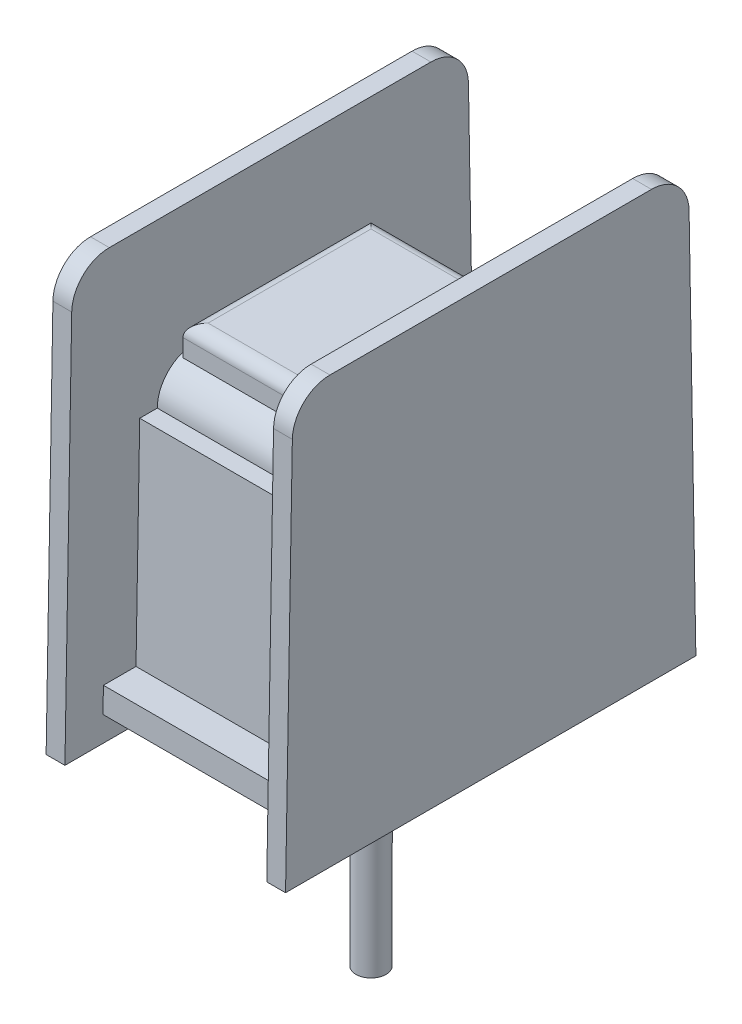
ISO-10303-21;
HEADER;
FILE_DESCRIPTION(('STEP AP214'),'2;1');
FILE_NAME('part.step','',(''),(''),'','','');
FILE_SCHEMA(('AUTOMOTIVE_DESIGN { 1 0 10303 214 1 1 1 1 }'));
ENDSEC;
DATA;
#1=APPLICATION_CONTEXT('core data for automotive mechanical design processes');
#2=APPLICATION_PROTOCOL_DEFINITION('international standard','automotive_design',2000,#1);
#3=PRODUCT_CONTEXT('',#1,'mechanical');
#4=PRODUCT('Part','Part','',(#3));
#5=PRODUCT_RELATED_PRODUCT_CATEGORY('part','',(#4));
#6=PRODUCT_DEFINITION_FORMATION('','',#4);
#7=PRODUCT_DEFINITION_CONTEXT('part definition',#1,'design');
#8=PRODUCT_DEFINITION('design','',#6,#7);
#9=PRODUCT_DEFINITION_SHAPE('','',#8);
#10=(LENGTH_UNIT() NAMED_UNIT(*) SI_UNIT(.MILLI.,.METRE.));
#11=(NAMED_UNIT(*) PLANE_ANGLE_UNIT() SI_UNIT($,.RADIAN.));
#12=(NAMED_UNIT(*) SI_UNIT($,.STERADIAN.) SOLID_ANGLE_UNIT());
#13=UNCERTAINTY_MEASURE_WITH_UNIT(LENGTH_MEASURE(1.E-05),#10,'distance_accuracy_value','');
#14=(GEOMETRIC_REPRESENTATION_CONTEXT(3) GLOBAL_UNCERTAINTY_ASSIGNED_CONTEXT((#13)) GLOBAL_UNIT_ASSIGNED_CONTEXT((#10,
#11,#12)) REPRESENTATION_CONTEXT('',''));
#15=CARTESIAN_POINT('',(0.,0.,0.));
#16=DIRECTION('',(0.,0.,1.));
#17=DIRECTION('',(1.,0.,0.));
#18=AXIS2_PLACEMENT_3D('',#15,#16,#17);
#19=CARTESIAN_POINT('',(4.025,12.,-4.5));
#20=DIRECTION('',(0.,-1.,0.));
#21=DIRECTION('',(0.,0.,-1.));
#22=AXIS2_PLACEMENT_3D('',#19,#20,#21);
#23=PLANE('',#22);
#24=DIRECTION('',(0.,0.,-1.));
#25=VECTOR('',#24,1.);
#26=CARTESIAN_POINT('',(3.75,12.,3.75));
#27=LINE('',#26,#25);
#28=CARTESIAN_POINT('',(3.75,12.,3.));
#29=VERTEX_POINT('',#28);
#30=CARTESIAN_POINT('',(3.75,12.,-3.));
#31=VERTEX_POINT('',#30);
#32=EDGE_CURVE('E259',#29,#31,#27,.T.);
#33=ORIENTED_EDGE('',*,*,#32,.F.);
#34=DIRECTION('',(1.,0.,0.));
#35=VECTOR('',#34,1.);
#36=CARTESIAN_POINT('',(4.025,12.,3.));
#37=LINE('',#36,#35);
#38=CARTESIAN_POINT('',(4.025,12.,3.));
#39=VERTEX_POINT('',#38);
#40=EDGE_CURVE('E460',#29,#39,#37,.T.);
#41=ORIENTED_EDGE('',*,*,#40,.T.);
#42=DIRECTION('',(0.,0.,-1.));
#43=VECTOR('',#42,1.);
#44=CARTESIAN_POINT('',(4.025,12.,-4.5));
#45=LINE('',#44,#43);
#46=CARTESIAN_POINT('',(4.025,12.,-3.));
#47=VERTEX_POINT('',#46);
#48=EDGE_CURVE('E293',#39,#47,#45,.T.);
#49=ORIENTED_EDGE('',*,*,#48,.T.);
#50=DIRECTION('',(-1.,0.,0.));
#51=VECTOR('',#50,1.);
#52=CARTESIAN_POINT('',(4.025,12.,-3.));
#53=LINE('',#52,#51);
#54=EDGE_CURVE('E466',#47,#31,#53,.T.);
#55=ORIENTED_EDGE('',*,*,#54,.T.);
#56=EDGE_LOOP('',(#33,#41,#49,#55));
#57=FACE_BOUND('',#56,.T.);
#58=ADVANCED_FACE('F32',(#57),#23,.F.);
#59=DIRECTION('',(0.,0.,1.));
#60=VECTOR('',#59,1.);
#61=CARTESIAN_POINT('',(-3.75,12.,3.75));
#62=LINE('',#61,#60);
#63=CARTESIAN_POINT('',(-3.75,12.,-3.));
#64=VERTEX_POINT('',#63);
#65=CARTESIAN_POINT('',(-3.75,12.,3.));
#66=VERTEX_POINT('',#65);
#67=EDGE_CURVE('E271',#64,#66,#62,.T.);
#68=ORIENTED_EDGE('',*,*,#67,.F.);
#69=CARTESIAN_POINT('',(-4.025,12.,-3.));
#70=VERTEX_POINT('',#69);
#71=EDGE_CURVE('E464',#64,#70,#53,.T.);
#72=ORIENTED_EDGE('',*,*,#71,.T.);
#73=DIRECTION('',(0.,0.,1.));
#74=VECTOR('',#73,1.);
#75=CARTESIAN_POINT('',(-4.025,12.,-4.5));
#76=LINE('',#75,#74);
#77=CARTESIAN_POINT('',(-4.025,12.,3.));
#78=VERTEX_POINT('',#77);
#79=EDGE_CURVE('E296',#70,#78,#76,.T.);
#80=ORIENTED_EDGE('',*,*,#79,.T.);
#81=EDGE_CURVE('E461',#78,#66,#37,.T.);
#82=ORIENTED_EDGE('',*,*,#81,.T.);
#83=EDGE_LOOP('',(#68,#72,#80,#82));
#84=FACE_BOUND('',#83,.T.);
#85=ADVANCED_FACE('F548',(#84),#23,.F.);
#86=CARTESIAN_POINT('',(4.025,1.,-6.68327818174629));
#87=DIRECTION('',(0.,1.,0.));
#88=DIRECTION('',(0.,0.,1.));
#89=AXIS2_PLACEMENT_3D('',#86,#87,#88);
#90=PLANE('',#89);
#91=DIRECTION('',(1.,0.,0.));
#92=VECTOR('',#91,1.);
#93=CARTESIAN_POINT('',(4.025,1.,-6.66582311681807));
#94=LINE('',#93,#92);
#95=CARTESIAN_POINT('',(-4.025,1.,-6.66582311681807));
#96=VERTEX_POINT('',#95);
#97=CARTESIAN_POINT('',(4.025,1.,-6.66582311681807));
#98=VERTEX_POINT('',#97);
#99=EDGE_CURVE('E303',#96,#98,#94,.T.);
#100=ORIENTED_EDGE('',*,*,#99,.T.);
#101=DIRECTION('',(0.,0.,1.));
#102=VECTOR('',#101,1.);
#103=CARTESIAN_POINT('',(4.025,1.,6.68327818174629));
#104=LINE('',#103,#102);
#105=CARTESIAN_POINT('',(4.025,0.999999999999997,6.66582311681807));
#106=VERTEX_POINT('',#105);
#107=EDGE_CURVE('E299',#98,#106,#104,.T.);
#108=ORIENTED_EDGE('',*,*,#107,.T.);
#109=DIRECTION('',(-1.,0.,0.));
#110=VECTOR('',#109,1.);
#111=CARTESIAN_POINT('',(4.025,1.,6.66582311681807));
#112=LINE('',#111,#110);
#113=CARTESIAN_POINT('',(-4.025,1.,6.66582311681807));
#114=VERTEX_POINT('',#113);
#115=EDGE_CURVE('E417',#106,#114,#112,.T.);
#116=ORIENTED_EDGE('',*,*,#115,.T.);
#117=DIRECTION('',(0.,0.,-1.));
#118=VECTOR('',#117,1.);
#119=CARTESIAN_POINT('',(-4.025,1.,6.68327818174629));
#120=LINE('',#119,#118);
#121=EDGE_CURVE('E301',#114,#96,#120,.T.);
#122=ORIENTED_EDGE('',*,*,#121,.T.);
#123=EDGE_LOOP('',(#100,#108,#116,#122));
#124=FACE_BOUND('',#123,.T.);
#125=CARTESIAN_POINT('',(0.,1.,0.));
#126=DIRECTION('',(0.,1.,0.));
#127=DIRECTION('',(0.,0.,1.));
#128=AXIS2_PLACEMENT_3D('',#125,#126,#127);
#129=CIRCLE('',#128,0.6);
#130=CARTESIAN_POINT('',(0.,1.,0.6));
#131=VERTEX_POINT('',#130);
#132=EDGE_CURVE('E457',#131,#131,#129,.F.);
#133=ORIENTED_EDGE('',*,*,#132,.F.);
#134=EDGE_LOOP('',(#133));
#135=FACE_BOUND('',#134,.T.);
#136=ADVANCED_FACE('F553',(#124,#135),#90,.F.);
#137=CARTESIAN_POINT('',(4.025,10.5,-8.));
#138=DIRECTION('',(0.,1.,0.));
#139=DIRECTION('',(0.,0.,1.));
#140=AXIS2_PLACEMENT_3D('',#137,#138,#139);
#141=PLANE('',#140);
#142=DIRECTION('',(0.,0.,1.));
#143=VECTOR('',#142,1.);
#144=CARTESIAN_POINT('',(-4.025,10.5,8.));
#145=LINE('',#144,#143);
#146=CARTESIAN_POINT('',(-4.025,10.5,-5.2));
#147=VERTEX_POINT('',#146);
#148=CARTESIAN_POINT('',(-4.025,10.5,-4.5));
#149=VERTEX_POINT('',#148);
#150=EDGE_CURVE('E340',#147,#149,#145,.T.);
#151=ORIENTED_EDGE('',*,*,#150,.T.);
#152=DIRECTION('',(-1.,0.,0.));
#153=VECTOR('',#152,1.);
#154=CARTESIAN_POINT('',(4.025,10.5,-4.5));
#155=LINE('',#154,#153);
#156=CARTESIAN_POINT('',(4.025,10.5,-4.5));
#157=VERTEX_POINT('',#156);
#158=EDGE_CURVE('E287',#157,#149,#155,.T.);
#159=ORIENTED_EDGE('',*,*,#158,.F.);
#160=DIRECTION('',(0.,0.,-1.));
#161=VECTOR('',#160,1.);
#162=CARTESIAN_POINT('',(4.025,10.5,8.));
#163=LINE('',#162,#161);
#164=CARTESIAN_POINT('',(4.025,10.5,-5.2));
#165=VERTEX_POINT('',#164);
#166=EDGE_CURVE('E335',#157,#165,#163,.T.);
#167=ORIENTED_EDGE('',*,*,#166,.T.);
#168=DIRECTION('',(1.,0.,0.));
#169=VECTOR('',#168,1.);
#170=CARTESIAN_POINT('',(4.025,10.5,-5.2));
#171=LINE('',#170,#169);
#172=EDGE_CURVE('E329',#147,#165,#171,.T.);
#173=ORIENTED_EDGE('',*,*,#172,.F.);
#174=EDGE_LOOP('',(#151,#159,#167,#173));
#175=FACE_BOUND('',#174,.T.);
#176=ADVANCED_FACE('F578',(#175),#141,.T.);
#177=CARTESIAN_POINT('',(4.025,10.5,5.2));
#178=VERTEX_POINT('',#177);
#179=CARTESIAN_POINT('',(4.025,10.5,4.5));
#180=VERTEX_POINT('',#179);
#181=EDGE_CURVE('E336',#178,#180,#163,.T.);
#182=ORIENTED_EDGE('',*,*,#181,.T.);
#183=DIRECTION('',(1.,0.,0.));
#184=VECTOR('',#183,1.);
#185=CARTESIAN_POINT('',(4.025,10.5,4.5));
#186=LINE('',#185,#184);
#187=CARTESIAN_POINT('',(-4.025,10.5,4.5));
#188=VERTEX_POINT('',#187);
#189=EDGE_CURVE('E290',#188,#180,#186,.T.);
#190=ORIENTED_EDGE('',*,*,#189,.F.);
#191=CARTESIAN_POINT('',(-4.025,10.5,5.2));
#192=VERTEX_POINT('',#191);
#193=EDGE_CURVE('E339',#188,#192,#145,.T.);
#194=ORIENTED_EDGE('',*,*,#193,.T.);
#195=DIRECTION('',(1.,0.,0.));
#196=VECTOR('',#195,1.);
#197=CARTESIAN_POINT('',(4.025,10.5,5.2));
#198=LINE('',#197,#196);
#199=EDGE_CURVE('E400',#192,#178,#198,.T.);
#200=ORIENTED_EDGE('',*,*,#199,.T.);
#201=EDGE_LOOP('',(#182,#190,#194,#200));
#202=FACE_BOUND('',#201,.T.);
#203=ADVANCED_FACE('F592',(#202),#141,.T.);
#204=CARTESIAN_POINT('',(4.025,10.5,8.));
#205=DIRECTION('',(1.,0.,0.));
#206=DIRECTION('',(0.,0.,-1.));
#207=AXIS2_PLACEMENT_3D('',#204,#205,#206);
#208=PLANE('',#207);
#209=DIRECTION('',(0.,-0.999847695156391,0.0174524064372836));
#210=VECTOR('',#209,1.);
#211=CARTESIAN_POINT('',(4.025,10.5,8.));
#212=LINE('',#211,#210);
#213=CARTESIAN_POINT('',(4.025,0.,8.18327818174628));
#214=VERTEX_POINT('',#213);
#215=CARTESIAN_POINT('',(4.025,15.5261786096559,7.91226772602763));
#216=VERTEX_POINT('',#215);
#217=EDGE_CURVE('E348',#214,#216,#212,.F.);
#218=ORIENTED_EDGE('',*,*,#217,.T.);
#219=CARTESIAN_POINT('',(4.025,15.5,6.41249618329305));
#220=DIRECTION('',(1.,0.,0.));
#221=DIRECTION('',(0.,0.,-1.));
#222=AXIS2_PLACEMENT_3D('',#219,#220,#221);
#223=CIRCLE('',#222,1.5);
#224=CARTESIAN_POINT('',(4.025,17.,6.41249618329305));
#225=VERTEX_POINT('',#224);
#226=EDGE_CURVE('E435',#216,#225,#223,.F.);
#227=ORIENTED_EDGE('',*,*,#226,.T.);
#228=DIRECTION('',(0.,0.,-1.));
#229=VECTOR('',#228,1.);
#230=CARTESIAN_POINT('',(4.025,17.,8.));
#231=LINE('',#230,#229);
#232=CARTESIAN_POINT('',(4.025,17.,-6.41249618329305));
#233=VERTEX_POINT('',#232);
#234=EDGE_CURVE('E325',#225,#233,#231,.T.);
#235=ORIENTED_EDGE('',*,*,#234,.T.);
#236=CARTESIAN_POINT('',(4.025,15.5,-6.41249618329305));
#237=DIRECTION('',(1.,0.,0.));
#238=DIRECTION('',(0.,0.,-1.));
#239=AXIS2_PLACEMENT_3D('',#236,#237,#238);
#240=CIRCLE('',#239,1.5);
#241=CARTESIAN_POINT('',(4.025,15.5261786096559,-7.91226772602764));
#242=VERTEX_POINT('',#241);
#243=EDGE_CURVE('E433',#233,#242,#240,.F.);
#244=ORIENTED_EDGE('',*,*,#243,.T.);
#245=DIRECTION('',(0.,-0.999847695156391,-0.0174524064372836));
#246=VECTOR('',#245,1.);
#247=CARTESIAN_POINT('',(4.025,10.5,-8.));
#248=LINE('',#247,#246);
#249=CARTESIAN_POINT('',(4.025,0.,-8.18327818174629));
#250=VERTEX_POINT('',#249);
#251=EDGE_CURVE('E343',#250,#242,#248,.F.);
#252=ORIENTED_EDGE('',*,*,#251,.F.);
#253=DIRECTION('',(0.,0.,-1.));
#254=VECTOR('',#253,1.);
#255=CARTESIAN_POINT('',(4.025,0.,-6.5));
#256=LINE('',#255,#254);
#257=EDGE_CURVE('E318',#214,#250,#256,.T.);
#258=ORIENTED_EDGE('',*,*,#257,.F.);
#259=EDGE_LOOP('',(#218,#227,#235,#244,#252,#258));
#260=FACE_BOUND('',#259,.T.);
#261=ORIENTED_EDGE('',*,*,#166,.F.);
#262=CARTESIAN_POINT('',(4.025,10.5,-3.));
#263=DIRECTION('',(1.,0.,0.));
#264=DIRECTION('',(0.,0.,-1.));
#265=AXIS2_PLACEMENT_3D('',#262,#263,#264);
#266=CIRCLE('',#265,1.5);
#267=EDGE_CURVE('E471',#157,#47,#266,.T.);
#268=ORIENTED_EDGE('',*,*,#267,.T.);
#269=ORIENTED_EDGE('',*,*,#48,.F.);
#270=CARTESIAN_POINT('',(4.025,10.5,3.));
#271=DIRECTION('',(1.,0.,0.));
#272=DIRECTION('',(0.,0.,-1.));
#273=AXIS2_PLACEMENT_3D('',#270,#271,#272);
#274=CIRCLE('',#273,1.5);
#275=EDGE_CURVE('E473',#39,#180,#274,.T.);
#276=ORIENTED_EDGE('',*,*,#275,.T.);
#277=ORIENTED_EDGE('',*,*,#181,.F.);
#278=DIRECTION('',(0.,-0.999847695156391,0.0174524064372836));
#279=VECTOR('',#278,1.);
#280=CARTESIAN_POINT('',(4.025,10.4511407046165,5.20085284217327));
#281=LINE('',#280,#279);
#282=CARTESIAN_POINT('',(4.025,2.,5.34836805188985));
#283=VERTEX_POINT('',#282);
#284=EDGE_CURVE('E397',#178,#283,#281,.T.);
#285=ORIENTED_EDGE('',*,*,#284,.T.);
#286=DIRECTION('',(0.,0.,1.));
#287=VECTOR('',#286,1.);
#288=CARTESIAN_POINT('',(4.025,2.,5.2));
#289=LINE('',#288,#287);
#290=CARTESIAN_POINT('',(4.025,2.,6.64836805188985));
#291=VERTEX_POINT('',#290);
#292=EDGE_CURVE('E306',#283,#291,#289,.T.);
#293=ORIENTED_EDGE('',*,*,#292,.T.);
#294=DIRECTION('',(0.,-0.999847695156391,0.0174524064372836));
#295=VECTOR('',#294,1.);
#296=CARTESIAN_POINT('',(4.025,10.4738253774731,6.50045687973568));
#297=LINE('',#296,#295);
#298=EDGE_CURVE('E305',#291,#106,#297,.T.);
#299=ORIENTED_EDGE('',*,*,#298,.T.);
#300=ORIENTED_EDGE('',*,*,#107,.F.);
#301=DIRECTION('',(0.,-0.999847695156391,-0.0174524064372836));
#302=VECTOR('',#301,1.);
#303=CARTESIAN_POINT('',(4.025,10.5,-6.5));
#304=LINE('',#303,#302);
#305=CARTESIAN_POINT('',(4.025,2.,-6.64836805188985));
#306=VERTEX_POINT('',#305);
#307=EDGE_CURVE('E309',#306,#98,#304,.T.);
#308=ORIENTED_EDGE('',*,*,#307,.F.);
#309=DIRECTION('',(0.,0.,-1.));
#310=VECTOR('',#309,1.);
#311=CARTESIAN_POINT('',(4.025,2.,-5.2));
#312=LINE('',#311,#310);
#313=CARTESIAN_POINT('',(4.025,2.,-5.34836805188985));
#314=VERTEX_POINT('',#313);
#315=EDGE_CURVE('E326',#314,#306,#312,.T.);
#316=ORIENTED_EDGE('',*,*,#315,.F.);
#317=DIRECTION('',(0.,-0.999847695156391,-0.0174524064372836));
#318=VECTOR('',#317,1.);
#319=CARTESIAN_POINT('',(4.025,10.5,-5.2));
#320=LINE('',#319,#318);
#321=EDGE_CURVE('E317',#165,#314,#320,.T.);
#322=ORIENTED_EDGE('',*,*,#321,.F.);
#323=EDGE_LOOP('',(#261,#268,#269,#276,#277,#285,#293,#299,#300,#308,#316,#322));
#324=FACE_BOUND('',#323,.T.);
#325=ADVANCED_FACE('F509',(#260,#324),#208,.F.);
#326=CARTESIAN_POINT('',(-4.025,10.5,8.));
#327=DIRECTION('',(-1.,0.,0.));
#328=DIRECTION('',(0.,0.,1.));
#329=AXIS2_PLACEMENT_3D('',#326,#327,#328);
#330=PLANE('',#329);
#331=DIRECTION('',(0.,0.,1.));
#332=VECTOR('',#331,1.);
#333=CARTESIAN_POINT('',(-4.025,17.,8.));
#334=LINE('',#333,#332);
#335=CARTESIAN_POINT('',(-4.025,17.,-6.41249618329305));
#336=VERTEX_POINT('',#335);
#337=CARTESIAN_POINT('',(-4.025,17.,6.41249618329305));
#338=VERTEX_POINT('',#337);
#339=EDGE_CURVE('E332',#336,#338,#334,.T.);
#340=ORIENTED_EDGE('',*,*,#339,.T.);
#341=CARTESIAN_POINT('',(-4.025,15.5,6.41249618329305));
#342=DIRECTION('',(-1.,0.,0.));
#343=DIRECTION('',(0.,0.,1.));
#344=AXIS2_PLACEMENT_3D('',#341,#342,#343);
#345=CIRCLE('',#344,1.5);
#346=CARTESIAN_POINT('',(-4.025,15.5261786096559,7.91226772602764));
#347=VERTEX_POINT('',#346);
#348=EDGE_CURVE('E445',#338,#347,#345,.F.);
#349=ORIENTED_EDGE('',*,*,#348,.T.);
#350=DIRECTION('',(0.,-0.999847695156391,0.0174524064372836));
#351=VECTOR('',#350,1.);
#352=CARTESIAN_POINT('',(-4.025,10.5,8.));
#353=LINE('',#352,#351);
#354=CARTESIAN_POINT('',(-4.025,0.,8.18327818174628));
#355=VERTEX_POINT('',#354);
#356=EDGE_CURVE('E364',#355,#347,#353,.F.);
#357=ORIENTED_EDGE('',*,*,#356,.F.);
#358=DIRECTION('',(0.,0.,-1.));
#359=VECTOR('',#358,1.);
#360=CARTESIAN_POINT('',(-4.025,0.,-6.5));
#361=LINE('',#360,#359);
#362=CARTESIAN_POINT('',(-4.025,0.,-8.18327818174629));
#363=VERTEX_POINT('',#362);
#364=EDGE_CURVE('E314',#355,#363,#361,.T.);
#365=ORIENTED_EDGE('',*,*,#364,.T.);
#366=DIRECTION('',(0.,-0.999847695156391,-0.0174524064372836));
#367=VECTOR('',#366,1.);
#368=CARTESIAN_POINT('',(-4.025,10.77919597362,-7.99512661615277));
#369=LINE('',#368,#367);
#370=CARTESIAN_POINT('',(-4.025,15.5261786096559,-7.91226772602764));
#371=VERTEX_POINT('',#370);
#372=EDGE_CURVE('E376',#363,#371,#369,.F.);
#373=ORIENTED_EDGE('',*,*,#372,.T.);
#374=CARTESIAN_POINT('',(-4.025,15.5,-6.41249618329305));
#375=DIRECTION('',(-1.,0.,0.));
#376=DIRECTION('',(0.,0.,1.));
#377=AXIS2_PLACEMENT_3D('',#374,#375,#376);
#378=CIRCLE('',#377,1.5);
#379=EDGE_CURVE('E443',#371,#336,#378,.F.);
#380=ORIENTED_EDGE('',*,*,#379,.T.);
#381=EDGE_LOOP('',(#340,#349,#357,#365,#373,#380));
#382=FACE_BOUND('',#381,.T.);
#383=ORIENTED_EDGE('',*,*,#79,.F.);
#384=CARTESIAN_POINT('',(-4.025,10.5,-3.));
#385=DIRECTION('',(-1.,0.,0.));
#386=DIRECTION('',(0.,0.,1.));
#387=AXIS2_PLACEMENT_3D('',#384,#385,#386);
#388=CIRCLE('',#387,1.5);
#389=EDGE_CURVE('E469',#70,#149,#388,.T.);
#390=ORIENTED_EDGE('',*,*,#389,.T.);
#391=ORIENTED_EDGE('',*,*,#150,.F.);
#392=DIRECTION('',(0.,0.999847695156391,0.0174524064372836));
#393=VECTOR('',#392,1.);
#394=CARTESIAN_POINT('',(-4.025,10.5,-5.2));
#395=LINE('',#394,#393);
#396=CARTESIAN_POINT('',(-4.025,2.,-5.34836805188985));
#397=VERTEX_POINT('',#396);
#398=EDGE_CURVE('E382',#397,#147,#395,.T.);
#399=ORIENTED_EDGE('',*,*,#398,.F.);
#400=DIRECTION('',(0.,0.,-1.));
#401=VECTOR('',#400,1.);
#402=CARTESIAN_POINT('',(-4.025,2.,-5.2));
#403=LINE('',#402,#401);
#404=CARTESIAN_POINT('',(-4.025,2.,-6.64836805188985));
#405=VERTEX_POINT('',#404);
#406=EDGE_CURVE('E322',#397,#405,#403,.T.);
#407=ORIENTED_EDGE('',*,*,#406,.T.);
#408=DIRECTION('',(0.,0.999847695156391,0.0174524064372836));
#409=VECTOR('',#408,1.);
#410=CARTESIAN_POINT('',(-4.025,10.5,-6.5));
#411=LINE('',#410,#409);
#412=EDGE_CURVE('E393',#96,#405,#411,.T.);
#413=ORIENTED_EDGE('',*,*,#412,.F.);
#414=ORIENTED_EDGE('',*,*,#121,.F.);
#415=DIRECTION('',(0.,0.999847695156391,-0.0174524064372836));
#416=VECTOR('',#415,1.);
#417=CARTESIAN_POINT('',(-4.025,10.4738253774731,6.50045687973568));
#418=LINE('',#417,#416);
#419=CARTESIAN_POINT('',(-4.025,2.,6.64836805188985));
#420=VERTEX_POINT('',#419);
#421=EDGE_CURVE('E401',#114,#420,#418,.T.);
#422=ORIENTED_EDGE('',*,*,#421,.T.);
#423=DIRECTION('',(0.,0.,1.));
#424=VECTOR('',#423,1.);
#425=CARTESIAN_POINT('',(-4.025,2.,5.2));
#426=LINE('',#425,#424);
#427=CARTESIAN_POINT('',(-4.025,2.,5.34836805188985));
#428=VERTEX_POINT('',#427);
#429=EDGE_CURVE('E310',#428,#420,#426,.T.);
#430=ORIENTED_EDGE('',*,*,#429,.F.);
#431=DIRECTION('',(0.,0.999847695156391,-0.0174524064372836));
#432=VECTOR('',#431,1.);
#433=CARTESIAN_POINT('',(-4.025,10.4511407046165,5.20085284217327));
#434=LINE('',#433,#432);
#435=EDGE_CURVE('E403',#428,#192,#434,.T.);
#436=ORIENTED_EDGE('',*,*,#435,.T.);
#437=ORIENTED_EDGE('',*,*,#193,.F.);
#438=CARTESIAN_POINT('',(-4.025,10.5,3.));
#439=DIRECTION('',(-1.,0.,0.));
#440=DIRECTION('',(0.,0.,1.));
#441=AXIS2_PLACEMENT_3D('',#438,#439,#440);
#442=CIRCLE('',#441,1.5);
#443=EDGE_CURVE('E475',#188,#78,#442,.T.);
#444=ORIENTED_EDGE('',*,*,#443,.T.);
#445=EDGE_LOOP('',(#383,#390,#391,#399,#407,#413,#414,#422,#430,#436,#437,#444));
#446=FACE_BOUND('',#445,.T.);
#447=ADVANCED_FACE('F594',(#382,#446),#330,.F.);
#448=CARTESIAN_POINT('',(-4.775,0.,8.));
#449=DIRECTION('',(0.,1.,0.));
#450=DIRECTION('',(0.,0.,1.));
#451=AXIS2_PLACEMENT_3D('',#448,#449,#450);
#452=PLANE('',#451);
#453=DIRECTION('',(-1.,0.,0.));
#454=VECTOR('',#453,1.);
#455=CARTESIAN_POINT('',(4.025,0.,8.18327818174628));
#456=LINE('',#455,#454);
#457=CARTESIAN_POINT('',(4.775,0.,8.18327818174628));
#458=VERTEX_POINT('',#457);
#459=EDGE_CURVE('E347',#214,#458,#456,.F.);
#460=ORIENTED_EDGE('',*,*,#459,.F.);
#461=ORIENTED_EDGE('',*,*,#257,.T.);
#462=DIRECTION('',(1.,0.,0.));
#463=VECTOR('',#462,1.);
#464=CARTESIAN_POINT('',(4.025,0.,-8.18327818174629));
#465=LINE('',#464,#463);
#466=CARTESIAN_POINT('',(4.775,0.,-8.18327818174629));
#467=VERTEX_POINT('',#466);
#468=EDGE_CURVE('E358',#467,#250,#465,.F.);
#469=ORIENTED_EDGE('',*,*,#468,.F.);
#470=DIRECTION('',(0.,0.,-1.));
#471=VECTOR('',#470,1.);
#472=CARTESIAN_POINT('',(4.775,0.,-8.));
#473=LINE('',#472,#471);
#474=EDGE_CURVE('E349',#458,#467,#473,.T.);
#475=ORIENTED_EDGE('',*,*,#474,.F.);
#476=EDGE_LOOP('',(#460,#461,#469,#475));
#477=FACE_BOUND('',#476,.T.);
#478=ADVANCED_FACE('F597',(#477),#452,.F.);
#479=CARTESIAN_POINT('',(4.025,10.5,8.));
#480=DIRECTION('',(0.,0.0174524064372835,0.999847695156391));
#481=DIRECTION('',(0.,-0.999847695156391,0.0174524064372835));
#482=AXIS2_PLACEMENT_3D('',#479,#480,#481);
#483=PLANE('',#482);
#484=DIRECTION('',(0.,0.999847695156391,-0.0174524064372835));
#485=VECTOR('',#484,1.);
#486=CARTESIAN_POINT('',(4.775,17.2772161614321,7.88170325186964));
#487=LINE('',#486,#485);
#488=CARTESIAN_POINT('',(4.775,15.5261786096559,7.91226772602764));
#489=VERTEX_POINT('',#488);
#490=EDGE_CURVE('E365',#489,#458,#487,.F.);
#491=ORIENTED_EDGE('',*,*,#490,.F.);
#492=DIRECTION('',(1.,0.,0.));
#493=VECTOR('',#492,1.);
#494=CARTESIAN_POINT('',(4.025,15.5261786096559,7.91226772602763));
#495=LINE('',#494,#493);
#496=EDGE_CURVE('E431',#489,#216,#495,.F.);
#497=ORIENTED_EDGE('',*,*,#496,.T.);
#498=ORIENTED_EDGE('',*,*,#217,.F.);
#499=ORIENTED_EDGE('',*,*,#459,.T.);
#500=EDGE_LOOP('',(#491,#497,#498,#499));
#501=FACE_BOUND('',#500,.T.);
#502=ADVANCED_FACE('F620',(#501),#483,.T.);
#503=CARTESIAN_POINT('',(4.025,10.5,8.));
#504=DIRECTION('',(0.,0.0174524064372835,0.999847695156391));
#505=DIRECTION('',(0.,-0.999847695156391,0.0174524064372835));
#506=AXIS2_PLACEMENT_3D('',#503,#504,#505);
#507=PLANE('',#506);
#508=ORIENTED_EDGE('',*,*,#356,.T.);
#509=DIRECTION('',(1.,0.,0.));
#510=VECTOR('',#509,1.);
#511=CARTESIAN_POINT('',(-4.775,15.5261786096559,7.91226772602764));
#512=LINE('',#511,#510);
#513=CARTESIAN_POINT('',(-4.775,15.5261786096559,7.91226772602764));
#514=VERTEX_POINT('',#513);
#515=EDGE_CURVE('E447',#347,#514,#512,.F.);
#516=ORIENTED_EDGE('',*,*,#515,.T.);
#517=DIRECTION('',(0.,0.999847695156391,-0.0174524064372835));
#518=VECTOR('',#517,1.);
#519=CARTESIAN_POINT('',(-4.775,10.5,8.));
#520=LINE('',#519,#518);
#521=CARTESIAN_POINT('',(-4.775,0.,8.18327818174629));
#522=VERTEX_POINT('',#521);
#523=EDGE_CURVE('E367',#514,#522,#520,.F.);
#524=ORIENTED_EDGE('',*,*,#523,.T.);
#525=DIRECTION('',(-1.,0.,0.));
#526=VECTOR('',#525,1.);
#527=CARTESIAN_POINT('',(4.025,0.,8.18327818174628));
#528=LINE('',#527,#526);
#529=EDGE_CURVE('E353',#522,#355,#528,.F.);
#530=ORIENTED_EDGE('',*,*,#529,.T.);
#531=EDGE_LOOP('',(#508,#516,#524,#530));
#532=FACE_BOUND('',#531,.T.);
#533=ADVANCED_FACE('F604',(#532),#507,.T.);
#534=ORIENTED_EDGE('',*,*,#364,.F.);
#535=ORIENTED_EDGE('',*,*,#529,.F.);
#536=DIRECTION('',(0.,0.,1.));
#537=VECTOR('',#536,1.);
#538=CARTESIAN_POINT('',(-4.775,0.,-8.));
#539=LINE('',#538,#537);
#540=CARTESIAN_POINT('',(-4.775,0.,-8.18327818174629));
#541=VERTEX_POINT('',#540);
#542=EDGE_CURVE('E344',#541,#522,#539,.T.);
#543=ORIENTED_EDGE('',*,*,#542,.F.);
#544=DIRECTION('',(1.,0.,0.));
#545=VECTOR('',#544,1.);
#546=CARTESIAN_POINT('',(4.025,0.,-8.18327818174629));
#547=LINE('',#546,#545);
#548=EDGE_CURVE('E352',#363,#541,#547,.F.);
#549=ORIENTED_EDGE('',*,*,#548,.F.);
#550=EDGE_LOOP('',(#534,#535,#543,#549));
#551=FACE_BOUND('',#550,.T.);
#552=ADVANCED_FACE('F583',(#551),#452,.F.);
#553=CARTESIAN_POINT('',(4.025,2.,5.2));
#554=DIRECTION('',(0.,1.,0.));
#555=DIRECTION('',(0.,0.,1.));
#556=AXIS2_PLACEMENT_3D('',#553,#554,#555);
#557=PLANE('',#556);
#558=ORIENTED_EDGE('',*,*,#429,.T.);
#559=DIRECTION('',(1.,0.,0.));
#560=VECTOR('',#559,1.);
#561=CARTESIAN_POINT('',(4.025,2.,6.64836805188985));
#562=LINE('',#561,#560);
#563=EDGE_CURVE('E410',#420,#291,#562,.T.);
#564=ORIENTED_EDGE('',*,*,#563,.T.);
#565=ORIENTED_EDGE('',*,*,#292,.F.);
#566=DIRECTION('',(-1.,0.,0.));
#567=VECTOR('',#566,1.);
#568=CARTESIAN_POINT('',(4.025,2.,5.34836805188985));
#569=LINE('',#568,#567);
#570=EDGE_CURVE('E313',#283,#428,#569,.T.);
#571=ORIENTED_EDGE('',*,*,#570,.T.);
#572=EDGE_LOOP('',(#558,#564,#565,#571));
#573=FACE_BOUND('',#572,.T.);
#574=ADVANCED_FACE('F580',(#573),#557,.T.);
#575=CARTESIAN_POINT('',(4.025,10.5,-8.));
#576=DIRECTION('',(0.,0.0174524064372835,-0.999847695156391));
#577=DIRECTION('',(0.,0.999847695156391,0.0174524064372835));
#578=AXIS2_PLACEMENT_3D('',#575,#576,#577);
#579=PLANE('',#578);
#580=ORIENTED_EDGE('',*,*,#251,.T.);
#581=DIRECTION('',(-1.,0.,0.));
#582=VECTOR('',#581,1.);
#583=CARTESIAN_POINT('',(4.775,15.5261786096559,-7.91226772602764));
#584=LINE('',#583,#582);
#585=CARTESIAN_POINT('',(4.775,15.5261786096559,-7.91226772602764));
#586=VERTEX_POINT('',#585);
#587=EDGE_CURVE('E455',#242,#586,#584,.F.);
#588=ORIENTED_EDGE('',*,*,#587,.T.);
#589=DIRECTION('',(0.,0.999847695156391,0.0174524064372835));
#590=VECTOR('',#589,1.);
#591=CARTESIAN_POINT('',(4.775,10.5,-8.));
#592=LINE('',#591,#590);
#593=EDGE_CURVE('E368',#586,#467,#592,.F.);
#594=ORIENTED_EDGE('',*,*,#593,.T.);
#595=ORIENTED_EDGE('',*,*,#468,.T.);
#596=EDGE_LOOP('',(#580,#588,#594,#595));
#597=FACE_BOUND('',#596,.T.);
#598=ADVANCED_FACE('F34',(#597),#579,.T.);
#599=CARTESIAN_POINT('',(4.025,2.,-5.2));
#600=DIRECTION('',(0.,-1.,0.));
#601=DIRECTION('',(0.,0.,-1.));
#602=AXIS2_PLACEMENT_3D('',#599,#600,#601);
#603=PLANE('',#602);
#604=DIRECTION('',(1.,0.,0.));
#605=VECTOR('',#604,1.);
#606=CARTESIAN_POINT('',(4.025,2.,-6.64836805188985));
#607=LINE('',#606,#605);
#608=EDGE_CURVE('E321',#405,#306,#607,.T.);
#609=ORIENTED_EDGE('',*,*,#608,.F.);
#610=ORIENTED_EDGE('',*,*,#406,.F.);
#611=DIRECTION('',(-1.,0.,0.));
#612=VECTOR('',#611,1.);
#613=CARTESIAN_POINT('',(4.025,2.,-5.34836805188985));
#614=LINE('',#613,#612);
#615=EDGE_CURVE('E379',#314,#397,#614,.T.);
#616=ORIENTED_EDGE('',*,*,#615,.F.);
#617=ORIENTED_EDGE('',*,*,#315,.T.);
#618=EDGE_LOOP('',(#609,#610,#616,#617));
#619=FACE_BOUND('',#618,.T.);
#620=ADVANCED_FACE('F585',(#619),#603,.F.);
#621=CARTESIAN_POINT('',(-4.775,17.,8.));
#622=DIRECTION('',(0.,1.,0.));
#623=DIRECTION('',(0.,0.,1.));
#624=AXIS2_PLACEMENT_3D('',#621,#622,#623);
#625=PLANE('',#624);
#626=ORIENTED_EDGE('',*,*,#234,.F.);
#627=DIRECTION('',(-1.,0.,0.));
#628=VECTOR('',#627,1.);
#629=CARTESIAN_POINT('',(4.775,17.,6.41249618329305));
#630=LINE('',#629,#628);
#631=CARTESIAN_POINT('',(4.775,17.,6.41249618329305));
#632=VERTEX_POINT('',#631);
#633=EDGE_CURVE('E424',#225,#632,#630,.F.);
#634=ORIENTED_EDGE('',*,*,#633,.T.);
#635=DIRECTION('',(0.,0.,-1.));
#636=VECTOR('',#635,1.);
#637=CARTESIAN_POINT('',(4.775,17.,-8.));
#638=LINE('',#637,#636);
#639=CARTESIAN_POINT('',(4.775,17.,-6.41249618329305));
#640=VERTEX_POINT('',#639);
#641=EDGE_CURVE('E357',#632,#640,#638,.T.);
#642=ORIENTED_EDGE('',*,*,#641,.T.);
#643=DIRECTION('',(1.,0.,0.));
#644=VECTOR('',#643,1.);
#645=CARTESIAN_POINT('',(4.025,17.,-6.41249618329305));
#646=LINE('',#645,#644);
#647=EDGE_CURVE('E421',#640,#233,#646,.F.);
#648=ORIENTED_EDGE('',*,*,#647,.T.);
#649=EDGE_LOOP('',(#626,#634,#642,#648));
#650=FACE_BOUND('',#649,.T.);
#651=ADVANCED_FACE('F588',(#650),#625,.T.);
#652=CARTESIAN_POINT('',(-4.775,17.,-8.));
#653=DIRECTION('',(1.,0.,0.));
#654=DIRECTION('',(0.,0.,-1.));
#655=AXIS2_PLACEMENT_3D('',#652,#653,#654);
#656=PLANE('',#655);
#657=ORIENTED_EDGE('',*,*,#523,.F.);
#658=CARTESIAN_POINT('',(-4.775,15.5,6.41249618329305));
#659=DIRECTION('',(1.,0.,0.));
#660=DIRECTION('',(0.,0.,-1.));
#661=AXIS2_PLACEMENT_3D('',#658,#659,#660);
#662=CIRCLE('',#661,1.5);
#663=CARTESIAN_POINT('',(-4.775,17.,6.41249618329305));
#664=VERTEX_POINT('',#663);
#665=EDGE_CURVE('E451',#514,#664,#662,.F.);
#666=ORIENTED_EDGE('',*,*,#665,.T.);
#667=DIRECTION('',(0.,0.,1.));
#668=VECTOR('',#667,1.);
#669=CARTESIAN_POINT('',(-4.775,17.,-8.));
#670=LINE('',#669,#668);
#671=CARTESIAN_POINT('',(-4.775,17.,-6.41249618329305));
#672=VERTEX_POINT('',#671);
#673=EDGE_CURVE('E354',#672,#664,#670,.T.);
#674=ORIENTED_EDGE('',*,*,#673,.F.);
#675=CARTESIAN_POINT('',(-4.775,15.5,-6.41249618329305));
#676=DIRECTION('',(1.,0.,0.));
#677=DIRECTION('',(0.,0.,-1.));
#678=AXIS2_PLACEMENT_3D('',#675,#676,#677);
#679=CIRCLE('',#678,1.5);
#680=CARTESIAN_POINT('',(-4.775,15.5261786096559,-7.91226772602764));
#681=VERTEX_POINT('',#680);
#682=EDGE_CURVE('E449',#672,#681,#679,.F.);
#683=ORIENTED_EDGE('',*,*,#682,.T.);
#684=DIRECTION('',(0.,0.999847695156391,0.0174524064372835));
#685=VECTOR('',#684,1.);
#686=CARTESIAN_POINT('',(-4.775,16.9980201878121,-7.88657663571687));
#687=LINE('',#686,#685);
#688=EDGE_CURVE('E361',#681,#541,#687,.F.);
#689=ORIENTED_EDGE('',*,*,#688,.T.);
#690=ORIENTED_EDGE('',*,*,#542,.T.);
#691=EDGE_LOOP('',(#657,#666,#674,#683,#689,#690));
#692=FACE_BOUND('',#691,.T.);
#693=ADVANCED_FACE('F615',(#692),#656,.F.);
#694=CARTESIAN_POINT('',(4.775,17.,-8.));
#695=DIRECTION('',(-1.,0.,0.));
#696=DIRECTION('',(0.,0.,1.));
#697=AXIS2_PLACEMENT_3D('',#694,#695,#696);
#698=PLANE('',#697);
#699=ORIENTED_EDGE('',*,*,#641,.F.);
#700=CARTESIAN_POINT('',(4.775,15.5,6.41249618329305));
#701=DIRECTION('',(-1.,0.,0.));
#702=DIRECTION('',(0.,0.,1.));
#703=AXIS2_PLACEMENT_3D('',#700,#701,#702);
#704=CIRCLE('',#703,1.5);
#705=EDGE_CURVE('E429',#632,#489,#704,.F.);
#706=ORIENTED_EDGE('',*,*,#705,.T.);
#707=ORIENTED_EDGE('',*,*,#490,.T.);
#708=ORIENTED_EDGE('',*,*,#474,.T.);
#709=ORIENTED_EDGE('',*,*,#593,.F.);
#710=CARTESIAN_POINT('',(4.775,15.5,-6.41249618329305));
#711=DIRECTION('',(-1.,0.,0.));
#712=DIRECTION('',(0.,0.,1.));
#713=AXIS2_PLACEMENT_3D('',#710,#711,#712);
#714=CIRCLE('',#713,1.5);
#715=EDGE_CURVE('E427',#586,#640,#714,.F.);
#716=ORIENTED_EDGE('',*,*,#715,.T.);
#717=EDGE_LOOP('',(#699,#706,#707,#708,#709,#716));
#718=FACE_BOUND('',#717,.T.);
#719=ADVANCED_FACE('F612',(#718),#698,.F.);
#720=CARTESIAN_POINT('',(4.025,10.5,-8.));
#721=DIRECTION('',(0.,0.0174524064372835,-0.999847695156391));
#722=DIRECTION('',(0.,0.999847695156391,0.0174524064372835));
#723=AXIS2_PLACEMENT_3D('',#720,#721,#722);
#724=PLANE('',#723);
#725=ORIENTED_EDGE('',*,*,#688,.F.);
#726=DIRECTION('',(-1.,0.,0.));
#727=VECTOR('',#726,1.);
#728=CARTESIAN_POINT('',(-4.025,15.5261786096559,-7.91226772602764));
#729=LINE('',#728,#727);
#730=EDGE_CURVE('E453',#681,#371,#729,.F.);
#731=ORIENTED_EDGE('',*,*,#730,.T.);
#732=ORIENTED_EDGE('',*,*,#372,.F.);
#733=ORIENTED_EDGE('',*,*,#548,.T.);
#734=EDGE_LOOP('',(#725,#731,#732,#733));
#735=FACE_BOUND('',#734,.T.);
#736=ADVANCED_FACE('F610',(#735),#724,.T.);
#737=ORIENTED_EDGE('',*,*,#673,.T.);
#738=DIRECTION('',(-1.,0.,0.));
#739=VECTOR('',#738,1.);
#740=CARTESIAN_POINT('',(-4.025,17.,6.41249618329305));
#741=LINE('',#740,#739);
#742=EDGE_CURVE('E440',#664,#338,#741,.F.);
#743=ORIENTED_EDGE('',*,*,#742,.T.);
#744=ORIENTED_EDGE('',*,*,#339,.F.);
#745=DIRECTION('',(1.,0.,0.));
#746=VECTOR('',#745,1.);
#747=CARTESIAN_POINT('',(-4.775,17.,-6.41249618329305));
#748=LINE('',#747,#746);
#749=EDGE_CURVE('E437',#336,#672,#748,.F.);
#750=ORIENTED_EDGE('',*,*,#749,.T.);
#751=EDGE_LOOP('',(#737,#743,#744,#750));
#752=FACE_BOUND('',#751,.T.);
#753=ADVANCED_FACE('F606',(#752),#625,.T.);
#754=CARTESIAN_POINT('',(4.025,10.5,-5.2));
#755=DIRECTION('',(0.,0.0174524064372835,-0.999847695156391));
#756=DIRECTION('',(0.,0.999847695156391,0.0174524064372835));
#757=AXIS2_PLACEMENT_3D('',#754,#755,#756);
#758=PLANE('',#757);
#759=ORIENTED_EDGE('',*,*,#321,.T.);
#760=ORIENTED_EDGE('',*,*,#615,.T.);
#761=ORIENTED_EDGE('',*,*,#398,.T.);
#762=ORIENTED_EDGE('',*,*,#172,.T.);
#763=EDGE_LOOP('',(#759,#760,#761,#762));
#764=FACE_BOUND('',#763,.T.);
#765=ADVANCED_FACE('F609',(#764),#758,.T.);
#766=CARTESIAN_POINT('',(4.025,10.5,-6.5));
#767=DIRECTION('',(0.,0.0174524064372835,-0.999847695156391));
#768=DIRECTION('',(0.,0.999847695156391,0.0174524064372835));
#769=AXIS2_PLACEMENT_3D('',#766,#767,#768);
#770=PLANE('',#769);
#771=ORIENTED_EDGE('',*,*,#99,.F.);
#772=ORIENTED_EDGE('',*,*,#412,.T.);
#773=ORIENTED_EDGE('',*,*,#608,.T.);
#774=ORIENTED_EDGE('',*,*,#307,.T.);
#775=EDGE_LOOP('',(#771,#772,#773,#774));
#776=FACE_BOUND('',#775,.T.);
#777=ADVANCED_FACE('F633',(#776),#770,.T.);
#778=CARTESIAN_POINT('',(4.025,10.5,5.2));
#779=DIRECTION('',(0.,0.0174524064372835,0.999847695156391));
#780=DIRECTION('',(0.,-0.999847695156391,0.0174524064372835));
#781=AXIS2_PLACEMENT_3D('',#778,#779,#780);
#782=PLANE('',#781);
#783=ORIENTED_EDGE('',*,*,#284,.F.);
#784=ORIENTED_EDGE('',*,*,#199,.F.);
#785=ORIENTED_EDGE('',*,*,#435,.F.);
#786=ORIENTED_EDGE('',*,*,#570,.F.);
#787=EDGE_LOOP('',(#783,#784,#785,#786));
#788=FACE_BOUND('',#787,.T.);
#789=ADVANCED_FACE('F629',(#788),#782,.T.);
#790=CARTESIAN_POINT('',(4.025,10.5,6.5));
#791=DIRECTION('',(0.,0.0174524064372835,0.999847695156391));
#792=DIRECTION('',(0.,-0.999847695156391,0.0174524064372835));
#793=AXIS2_PLACEMENT_3D('',#790,#791,#792);
#794=PLANE('',#793);
#795=ORIENTED_EDGE('',*,*,#115,.F.);
#796=ORIENTED_EDGE('',*,*,#298,.F.);
#797=ORIENTED_EDGE('',*,*,#563,.F.);
#798=ORIENTED_EDGE('',*,*,#421,.F.);
#799=EDGE_LOOP('',(#795,#796,#797,#798));
#800=FACE_BOUND('',#799,.T.);
#801=ADVANCED_FACE('F574',(#800),#794,.T.);
#802=CARTESIAN_POINT('',(-4.775,15.5,6.41249618329305));
#803=DIRECTION('',(1.,0.,0.));
#804=DIRECTION('',(0.,0.,-1.));
#805=AXIS2_PLACEMENT_3D('',#802,#803,#804);
#806=CYLINDRICAL_SURFACE('',#805,1.5);
#807=ORIENTED_EDGE('',*,*,#226,.F.);
#808=ORIENTED_EDGE('',*,*,#496,.F.);
#809=ORIENTED_EDGE('',*,*,#705,.F.);
#810=ORIENTED_EDGE('',*,*,#633,.F.);
#811=EDGE_LOOP('',(#807,#808,#809,#810));
#812=FACE_BOUND('',#811,.T.);
#813=ADVANCED_FACE('F570',(#812),#806,.T.);
#814=CARTESIAN_POINT('',(-4.775,15.5,6.41249618329305));
#815=DIRECTION('',(1.,0.,0.));
#816=DIRECTION('',(0.,0.,-1.));
#817=AXIS2_PLACEMENT_3D('',#814,#815,#816);
#818=CYLINDRICAL_SURFACE('',#817,1.5);
#819=ORIENTED_EDGE('',*,*,#665,.F.);
#820=ORIENTED_EDGE('',*,*,#515,.F.);
#821=ORIENTED_EDGE('',*,*,#348,.F.);
#822=ORIENTED_EDGE('',*,*,#742,.F.);
#823=EDGE_LOOP('',(#819,#820,#821,#822));
#824=FACE_BOUND('',#823,.T.);
#825=ADVANCED_FACE('F566',(#824),#818,.T.);
#826=CARTESIAN_POINT('',(-4.775,15.5,-6.41249618329305));
#827=DIRECTION('',(-1.,0.,0.));
#828=DIRECTION('',(0.,0.,1.));
#829=AXIS2_PLACEMENT_3D('',#826,#827,#828);
#830=CYLINDRICAL_SURFACE('',#829,1.5);
#831=ORIENTED_EDGE('',*,*,#379,.F.);
#832=ORIENTED_EDGE('',*,*,#730,.F.);
#833=ORIENTED_EDGE('',*,*,#682,.F.);
#834=ORIENTED_EDGE('',*,*,#749,.F.);
#835=EDGE_LOOP('',(#831,#832,#833,#834));
#836=FACE_BOUND('',#835,.T.);
#837=ADVANCED_FACE('F562',(#836),#830,.T.);
#838=CARTESIAN_POINT('',(-4.775,15.5,-6.41249618329305));
#839=DIRECTION('',(-1.,0.,0.));
#840=DIRECTION('',(0.,0.,1.));
#841=AXIS2_PLACEMENT_3D('',#838,#839,#840);
#842=CYLINDRICAL_SURFACE('',#841,1.5);
#843=ORIENTED_EDGE('',*,*,#715,.F.);
#844=ORIENTED_EDGE('',*,*,#587,.F.);
#845=ORIENTED_EDGE('',*,*,#243,.F.);
#846=ORIENTED_EDGE('',*,*,#647,.F.);
#847=EDGE_LOOP('',(#843,#844,#845,#846));
#848=FACE_BOUND('',#847,.T.);
#849=ADVANCED_FACE('F559',(#848),#842,.T.);
#850=CARTESIAN_POINT('',(0.,-9.,0.));
#851=DIRECTION('',(0.,1.,0.));
#852=DIRECTION('',(0.,0.,1.));
#853=AXIS2_PLACEMENT_3D('',#850,#851,#852);
#854=CYLINDRICAL_SURFACE('',#853,0.6);
#855=CARTESIAN_POINT('',(0.,-9.,0.));
#856=DIRECTION('',(0.,-1.,0.));
#857=DIRECTION('',(0.,0.,-1.));
#858=AXIS2_PLACEMENT_3D('',#855,#856,#857);
#859=CIRCLE('',#858,0.6);
#860=CARTESIAN_POINT('',(0.,-9.,-0.6));
#861=VERTEX_POINT('',#860);
#862=EDGE_CURVE('E284',#861,#861,#859,.T.);
#863=ORIENTED_EDGE('',*,*,#862,.F.);
#864=EDGE_LOOP('',(#863));
#865=FACE_BOUND('',#864,.T.);
#866=ORIENTED_EDGE('',*,*,#132,.T.);
#867=EDGE_LOOP('',(#866));
#868=FACE_BOUND('',#867,.T.);
#869=ADVANCED_FACE('F557',(#865,#868),#854,.T.);
#870=CARTESIAN_POINT('',(0.,-9.,0.));
#871=DIRECTION('',(0.,-1.,0.));
#872=DIRECTION('',(0.,0.,-1.));
#873=AXIS2_PLACEMENT_3D('',#870,#871,#872);
#874=PLANE('',#873);
#875=ORIENTED_EDGE('',*,*,#862,.T.);
#876=EDGE_LOOP('',(#875));
#877=FACE_BOUND('',#876,.T.);
#878=ADVANCED_FACE('F668',(#877),#874,.T.);
#879=CARTESIAN_POINT('',(4.025,10.5,-3.));
#880=DIRECTION('',(-1.,0.,0.));
#881=DIRECTION('',(0.,0.,1.));
#882=AXIS2_PLACEMENT_3D('',#879,#880,#881);
#883=CYLINDRICAL_SURFACE('',#882,1.5);
#884=ORIENTED_EDGE('',*,*,#267,.F.);
#885=ORIENTED_EDGE('',*,*,#158,.T.);
#886=ORIENTED_EDGE('',*,*,#389,.F.);
#887=ORIENTED_EDGE('',*,*,#71,.F.);
#888=DIRECTION('',(-1.,0.,0.));
#889=VECTOR('',#888,1.);
#890=CARTESIAN_POINT('',(4.025,12.,-3.));
#891=LINE('',#890,#889);
#892=EDGE_CURVE('E250',#64,#31,#891,.F.);
#893=ORIENTED_EDGE('',*,*,#892,.T.);
#894=ORIENTED_EDGE('',*,*,#54,.F.);
#895=EDGE_LOOP('',(#884,#885,#886,#887,#893,#894));
#896=FACE_BOUND('',#895,.T.);
#897=ADVANCED_FACE('F513',(#896),#883,.T.);
#898=CARTESIAN_POINT('',(4.025,10.5,3.));
#899=DIRECTION('',(1.,0.,0.));
#900=DIRECTION('',(0.,0.,-1.));
#901=AXIS2_PLACEMENT_3D('',#898,#899,#900);
#902=CYLINDRICAL_SURFACE('',#901,1.5);
#903=ORIENTED_EDGE('',*,*,#443,.F.);
#904=ORIENTED_EDGE('',*,*,#189,.T.);
#905=ORIENTED_EDGE('',*,*,#275,.F.);
#906=ORIENTED_EDGE('',*,*,#40,.F.);
#907=EDGE_CURVE('E465',#66,#29,#37,.T.);
#908=ORIENTED_EDGE('',*,*,#907,.F.);
#909=ORIENTED_EDGE('',*,*,#81,.F.);
#910=EDGE_LOOP('',(#903,#904,#905,#906,#908,#909));
#911=FACE_BOUND('',#910,.T.);
#912=ADVANCED_FACE('F505',(#911),#902,.T.);
#913=CARTESIAN_POINT('',(3.75,12.,-3.75));
#914=DIRECTION('',(0.,1.,0.));
#915=DIRECTION('',(0.,0.,1.));
#916=AXIS2_PLACEMENT_3D('',#913,#914,#915);
#917=PLANE('',#916);
#918=ORIENTED_EDGE('',*,*,#892,.F.);
#919=CARTESIAN_POINT('',(-3.75,12.,-3.75));
#920=VERTEX_POINT('',#919);
#921=EDGE_CURVE('E267',#920,#64,#62,.T.);
#922=ORIENTED_EDGE('',*,*,#921,.F.);
#923=DIRECTION('',(-1.,0.,0.));
#924=VECTOR('',#923,1.);
#925=CARTESIAN_POINT('',(3.75,12.,-3.75));
#926=LINE('',#925,#924);
#927=CARTESIAN_POINT('',(3.75,12.,-3.75));
#928=VERTEX_POINT('',#927);
#929=EDGE_CURVE('E244',#928,#920,#926,.T.);
#930=ORIENTED_EDGE('',*,*,#929,.F.);
#931=EDGE_CURVE('E255',#31,#928,#27,.T.);
#932=ORIENTED_EDGE('',*,*,#931,.F.);
#933=EDGE_LOOP('',(#918,#922,#930,#932));
#934=FACE_BOUND('',#933,.T.);
#935=ADVANCED_FACE('F265',(#934),#917,.F.);
#936=CARTESIAN_POINT('',(3.75,13.2,3.75));
#937=DIRECTION('',(-1.,0.,0.));
#938=DIRECTION('',(0.,0.,1.));
#939=AXIS2_PLACEMENT_3D('',#936,#937,#938);
#940=PLANE('',#939);
#941=DIRECTION('',(0.,-1.,0.));
#942=VECTOR('',#941,1.);
#943=CARTESIAN_POINT('',(3.75,13.2,-3.75));
#944=LINE('',#943,#942);
#945=CARTESIAN_POINT('',(3.75,12.7,-3.75));
#946=VERTEX_POINT('',#945);
#947=EDGE_CURVE('E240',#946,#928,#944,.T.);
#948=ORIENTED_EDGE('',*,*,#947,.F.);
#949=DIRECTION('',(0.,0.,-1.));
#950=VECTOR('',#949,1.);
#951=CARTESIAN_POINT('',(3.75,12.7,3.75));
#952=LINE('',#951,#950);
#953=CARTESIAN_POINT('',(3.75,12.7,3.75));
#954=VERTEX_POINT('',#953);
#955=EDGE_CURVE('E486',#946,#954,#952,.F.);
#956=ORIENTED_EDGE('',*,*,#955,.T.);
#957=DIRECTION('',(0.,-1.,0.));
#958=VECTOR('',#957,1.);
#959=CARTESIAN_POINT('',(3.75,13.2,3.75));
#960=LINE('',#959,#958);
#961=CARTESIAN_POINT('',(3.75,12.,3.75));
#962=VERTEX_POINT('',#961);
#963=EDGE_CURVE('E278',#954,#962,#960,.T.);
#964=ORIENTED_EDGE('',*,*,#963,.T.);
#965=EDGE_CURVE('E264',#962,#29,#27,.T.);
#966=ORIENTED_EDGE('',*,*,#965,.T.);
#967=ORIENTED_EDGE('',*,*,#32,.T.);
#968=ORIENTED_EDGE('',*,*,#931,.T.);
#969=EDGE_LOOP('',(#948,#956,#964,#966,#967,#968));
#970=FACE_BOUND('',#969,.T.);
#971=ADVANCED_FACE('F256',(#970),#940,.F.);
#972=CARTESIAN_POINT('',(3.75,13.2,-3.75));
#973=DIRECTION('',(0.,0.,1.));
#974=DIRECTION('',(1.,0.,0.));
#975=AXIS2_PLACEMENT_3D('',#972,#973,#974);
#976=PLANE('',#975);
#977=DIRECTION('',(0.,-1.,0.));
#978=VECTOR('',#977,1.);
#979=CARTESIAN_POINT('',(-3.75,13.2,-3.75));
#980=LINE('',#979,#978);
#981=CARTESIAN_POINT('',(-3.75,12.7,-3.75));
#982=VERTEX_POINT('',#981);
#983=EDGE_CURVE('E251',#982,#920,#980,.T.);
#984=ORIENTED_EDGE('',*,*,#983,.F.);
#985=DIRECTION('',(-1.,0.,0.));
#986=VECTOR('',#985,1.);
#987=CARTESIAN_POINT('',(3.75,12.7,-3.75));
#988=LINE('',#987,#986);
#989=EDGE_CURVE('E40',#982,#946,#988,.F.);
#990=ORIENTED_EDGE('',*,*,#989,.T.);
#991=ORIENTED_EDGE('',*,*,#947,.T.);
#992=ORIENTED_EDGE('',*,*,#929,.T.);
#993=EDGE_LOOP('',(#984,#990,#991,#992));
#994=FACE_BOUND('',#993,.T.);
#995=ADVANCED_FACE('F242',(#994),#976,.F.);
#996=CARTESIAN_POINT('',(-3.75,13.2,3.75));
#997=DIRECTION('',(1.,0.,0.));
#998=DIRECTION('',(0.,0.,-1.));
#999=AXIS2_PLACEMENT_3D('',#996,#997,#998);
#1000=PLANE('',#999);
#1001=DIRECTION('',(0.,-1.,0.));
#1002=VECTOR('',#1001,1.);
#1003=CARTESIAN_POINT('',(-3.75,13.2,3.75));
#1004=LINE('',#1003,#1002);
#1005=CARTESIAN_POINT('',(-3.75,12.7,3.75));
#1006=VERTEX_POINT('',#1005);
#1007=CARTESIAN_POINT('',(-3.75,12.,3.75));
#1008=VERTEX_POINT('',#1007);
#1009=EDGE_CURVE('E280',#1006,#1008,#1004,.T.);
#1010=ORIENTED_EDGE('',*,*,#1009,.F.);
#1011=DIRECTION('',(0.,0.,1.));
#1012=VECTOR('',#1011,1.);
#1013=CARTESIAN_POINT('',(-3.75,12.7,-3.75));
#1014=LINE('',#1013,#1012);
#1015=EDGE_CURVE('E47',#1006,#982,#1014,.F.);
#1016=ORIENTED_EDGE('',*,*,#1015,.T.);
#1017=ORIENTED_EDGE('',*,*,#983,.T.);
#1018=ORIENTED_EDGE('',*,*,#921,.T.);
#1019=ORIENTED_EDGE('',*,*,#67,.T.);
#1020=EDGE_CURVE('E268',#66,#1008,#62,.T.);
#1021=ORIENTED_EDGE('',*,*,#1020,.T.);
#1022=EDGE_LOOP('',(#1010,#1016,#1017,#1018,#1019,#1021));
#1023=FACE_BOUND('',#1022,.T.);
#1024=ADVANCED_FACE('F516',(#1023),#1000,.F.);
#1025=CARTESIAN_POINT('',(3.75,13.2,3.75));
#1026=DIRECTION('',(0.,0.,-1.));
#1027=DIRECTION('',(-1.,0.,0.));
#1028=AXIS2_PLACEMENT_3D('',#1025,#1026,#1027);
#1029=PLANE('',#1028);
#1030=ORIENTED_EDGE('',*,*,#963,.F.);
#1031=DIRECTION('',(1.,0.,0.));
#1032=VECTOR('',#1031,1.);
#1033=CARTESIAN_POINT('',(-3.75,12.7,3.75));
#1034=LINE('',#1033,#1032);
#1035=EDGE_CURVE('E11',#954,#1006,#1034,.F.);
#1036=ORIENTED_EDGE('',*,*,#1035,.T.);
#1037=ORIENTED_EDGE('',*,*,#1009,.T.);
#1038=DIRECTION('',(1.,0.,0.));
#1039=VECTOR('',#1038,1.);
#1040=CARTESIAN_POINT('',(3.75,12.,3.75));
#1041=LINE('',#1040,#1039);
#1042=EDGE_CURVE('E275',#1008,#962,#1041,.T.);
#1043=ORIENTED_EDGE('',*,*,#1042,.T.);
#1044=EDGE_LOOP('',(#1030,#1036,#1037,#1043));
#1045=FACE_BOUND('',#1044,.T.);
#1046=ADVANCED_FACE('F490',(#1045),#1029,.F.);
#1047=CARTESIAN_POINT('',(3.75,13.2,-3.75));
#1048=DIRECTION('',(0.,1.,0.));
#1049=DIRECTION('',(0.,0.,1.));
#1050=AXIS2_PLACEMENT_3D('',#1047,#1048,#1049);
#1051=PLANE('',#1050);
#1052=DIRECTION('',(0.,0.,-1.));
#1053=VECTOR('',#1052,1.);
#1054=CARTESIAN_POINT('',(3.25,13.2,-3.75));
#1055=LINE('',#1054,#1053);
#1056=CARTESIAN_POINT('',(3.25,13.2,3.25));
#1057=VERTEX_POINT('',#1056);
#1058=CARTESIAN_POINT('',(3.25,13.2,-3.25));
#1059=VERTEX_POINT('',#1058);
#1060=EDGE_CURVE('E481',#1057,#1059,#1055,.T.);
#1061=ORIENTED_EDGE('',*,*,#1060,.T.);
#1062=DIRECTION('',(-1.,0.,0.));
#1063=VECTOR('',#1062,1.);
#1064=CARTESIAN_POINT('',(-3.75,13.2,-3.25));
#1065=LINE('',#1064,#1063);
#1066=CARTESIAN_POINT('',(-3.25,13.2,-3.25));
#1067=VERTEX_POINT('',#1066);
#1068=EDGE_CURVE('E484',#1059,#1067,#1065,.T.);
#1069=ORIENTED_EDGE('',*,*,#1068,.T.);
#1070=DIRECTION('',(0.,0.,1.));
#1071=VECTOR('',#1070,1.);
#1072=CARTESIAN_POINT('',(-3.25,13.2,3.75));
#1073=LINE('',#1072,#1071);
#1074=CARTESIAN_POINT('',(-3.25,13.2,3.25));
#1075=VERTEX_POINT('',#1074);
#1076=EDGE_CURVE('E479',#1067,#1075,#1073,.T.);
#1077=ORIENTED_EDGE('',*,*,#1076,.T.);
#1078=DIRECTION('',(1.,0.,0.));
#1079=VECTOR('',#1078,1.);
#1080=CARTESIAN_POINT('',(3.75,13.2,3.25));
#1081=LINE('',#1080,#1079);
#1082=EDGE_CURVE('E477',#1075,#1057,#1081,.T.);
#1083=ORIENTED_EDGE('',*,*,#1082,.T.);
#1084=EDGE_LOOP('',(#1061,#1069,#1077,#1083));
#1085=FACE_BOUND('',#1084,.T.);
#1086=ADVANCED_FACE('F539',(#1085),#1051,.T.);
#1087=ORIENTED_EDGE('',*,*,#907,.T.);
#1088=ORIENTED_EDGE('',*,*,#965,.F.);
#1089=ORIENTED_EDGE('',*,*,#1042,.F.);
#1090=ORIENTED_EDGE('',*,*,#1020,.F.);
#1091=EDGE_LOOP('',(#1087,#1088,#1089,#1090));
#1092=FACE_BOUND('',#1091,.T.);
#1093=ADVANCED_FACE('F496',(#1092),#917,.F.);
#1094=CARTESIAN_POINT('',(-3.25,12.7,-3.75));
#1095=DIRECTION('',(0.,0.,-1.));
#1096=DIRECTION('',(-1.,0.,0.));
#1097=AXIS2_PLACEMENT_3D('',#1094,#1095,#1096);
#1098=CYLINDRICAL_SURFACE('',#1097,0.5);
#1099=CARTESIAN_POINT('',(-3.25,12.7,-3.25));
#1100=DIRECTION('',(0.707106781186548,0.,-0.707106781186547));
#1101=DIRECTION('',(0.707106781186547,0.,0.707106781186548));
#1102=AXIS2_PLACEMENT_3D('',#1099,#1100,#1101);
#1103=ELLIPSE('',#1102,0.707106781186548,0.5);
#1104=EDGE_CURVE('E521',#982,#1067,#1103,.T.);
#1105=ORIENTED_EDGE('',*,*,#1104,.F.);
#1106=ORIENTED_EDGE('',*,*,#1015,.F.);
#1107=CARTESIAN_POINT('',(-3.25,12.7,3.25));
#1108=DIRECTION('',(-0.707106781186548,0.,-0.707106781186547));
#1109=DIRECTION('',(-0.707106781186547,0.,0.707106781186548));
#1110=AXIS2_PLACEMENT_3D('',#1107,#1108,#1109);
#1111=ELLIPSE('',#1110,0.707106781186548,0.5);
#1112=EDGE_CURVE('E262',#1075,#1006,#1111,.F.);
#1113=ORIENTED_EDGE('',*,*,#1112,.F.);
#1114=ORIENTED_EDGE('',*,*,#1076,.F.);
#1115=EDGE_LOOP('',(#1105,#1106,#1113,#1114));
#1116=FACE_BOUND('',#1115,.T.);
#1117=ADVANCED_FACE('F522',(#1116),#1098,.T.);
#1118=CARTESIAN_POINT('',(3.75,12.7,3.25));
#1119=DIRECTION('',(-1.,0.,0.));
#1120=DIRECTION('',(0.,0.,1.));
#1121=AXIS2_PLACEMENT_3D('',#1118,#1119,#1120);
#1122=CYLINDRICAL_SURFACE('',#1121,0.5);
#1123=ORIENTED_EDGE('',*,*,#1112,.T.);
#1124=ORIENTED_EDGE('',*,*,#1035,.F.);
#1125=CARTESIAN_POINT('',(3.25,12.7,3.25));
#1126=DIRECTION('',(-0.707106781186547,0.,0.707106781186548));
#1127=DIRECTION('',(-0.707106781186548,0.,-0.707106781186547));
#1128=AXIS2_PLACEMENT_3D('',#1125,#1126,#1127);
#1129=ELLIPSE('',#1128,0.707106781186547,0.5);
#1130=EDGE_CURVE('E527',#1057,#954,#1129,.F.);
#1131=ORIENTED_EDGE('',*,*,#1130,.F.);
#1132=ORIENTED_EDGE('',*,*,#1082,.F.);
#1133=EDGE_LOOP('',(#1123,#1124,#1131,#1132));
#1134=FACE_BOUND('',#1133,.T.);
#1135=ADVANCED_FACE('F536',(#1134),#1122,.T.);
#1136=CARTESIAN_POINT('',(3.75,12.7,-3.25));
#1137=DIRECTION('',(1.,0.,0.));
#1138=DIRECTION('',(0.,0.,-1.));
#1139=AXIS2_PLACEMENT_3D('',#1136,#1137,#1138);
#1140=CYLINDRICAL_SURFACE('',#1139,0.5);
#1141=ORIENTED_EDGE('',*,*,#1104,.T.);
#1142=ORIENTED_EDGE('',*,*,#1068,.F.);
#1143=CARTESIAN_POINT('',(3.25,12.7,-3.25));
#1144=DIRECTION('',(0.707106781186547,0.,0.707106781186548));
#1145=DIRECTION('',(0.707106781186548,0.,-0.707106781186547));
#1146=AXIS2_PLACEMENT_3D('',#1143,#1144,#1145);
#1147=ELLIPSE('',#1146,0.707106781186547,0.5);
#1148=EDGE_CURVE('E530',#946,#1059,#1147,.T.);
#1149=ORIENTED_EDGE('',*,*,#1148,.F.);
#1150=ORIENTED_EDGE('',*,*,#989,.F.);
#1151=EDGE_LOOP('',(#1141,#1142,#1149,#1150));
#1152=FACE_BOUND('',#1151,.T.);
#1153=ADVANCED_FACE('F529',(#1152),#1140,.T.);
#1154=CARTESIAN_POINT('',(3.25,12.7,-3.75));
#1155=DIRECTION('',(0.,0.,1.));
#1156=DIRECTION('',(1.,0.,0.));
#1157=AXIS2_PLACEMENT_3D('',#1154,#1155,#1156);
#1158=CYLINDRICAL_SURFACE('',#1157,0.5);
#1159=ORIENTED_EDGE('',*,*,#1130,.T.);
#1160=ORIENTED_EDGE('',*,*,#955,.F.);
#1161=ORIENTED_EDGE('',*,*,#1148,.T.);
#1162=ORIENTED_EDGE('',*,*,#1060,.F.);
#1163=EDGE_LOOP('',(#1159,#1160,#1161,#1162));
#1164=FACE_BOUND('',#1163,.T.);
#1165=ADVANCED_FACE('F540',(#1164),#1158,.T.);
#1166=CLOSED_SHELL('',(#58,#85,#136,#176,#203,#325,#447,#478,#502,#533,#552,#574,#598,#620,#651,
#693,#719,#736,#753,#765,#777,#789,#801,#813,#825,#837,#849,#869,#878,#897,#912,#935,#971,#995,
#1024,#1046,#1086,#1093,#1117,#1135,#1153,#1165));
#1167=MANIFOLD_SOLID_BREP('B2',#1166);
#1168=ADVANCED_BREP_SHAPE_REPRESENTATION('',(#18,#1167),#14);
#1169=SHAPE_DEFINITION_REPRESENTATION(#9,#1168);
ENDSEC;
END-ISO-10303-21;
